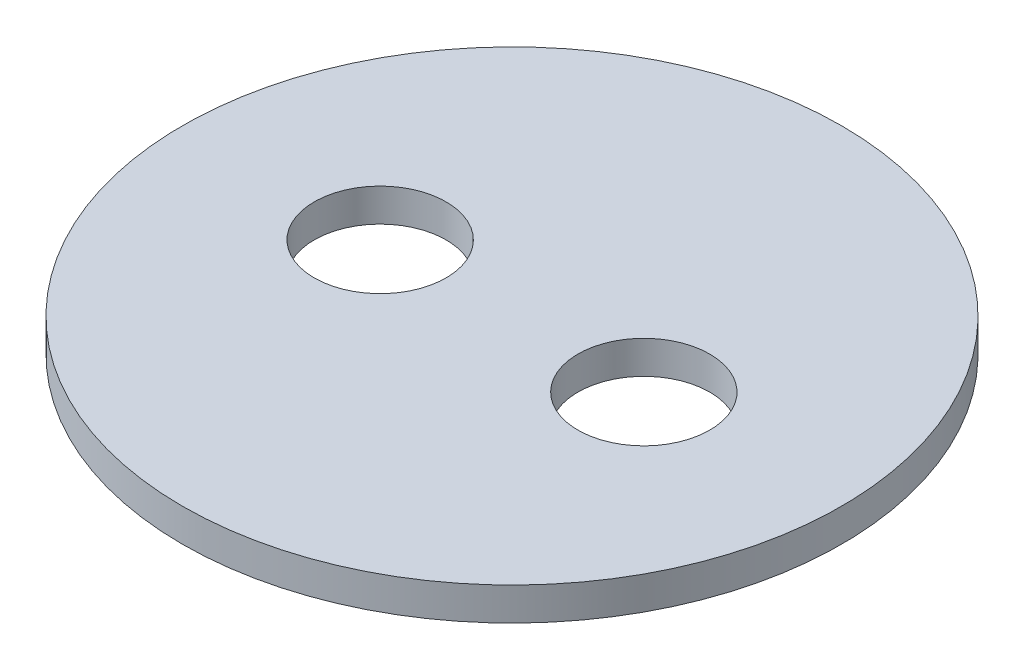
ISO-10303-21;
HEADER;
FILE_DESCRIPTION(('STEP AP214'),'2;1');
FILE_NAME('part.step','',(''),(''),'','','');
FILE_SCHEMA(('AUTOMOTIVE_DESIGN { 1 0 10303 214 1 1 1 1 }'));
ENDSEC;
DATA;
#1=APPLICATION_CONTEXT('core data for automotive mechanical design processes');
#2=APPLICATION_PROTOCOL_DEFINITION('international standard','automotive_design',2000,#1);
#3=PRODUCT_CONTEXT('',#1,'mechanical');
#4=PRODUCT('Part','Part','',(#3));
#5=PRODUCT_RELATED_PRODUCT_CATEGORY('part','',(#4));
#6=PRODUCT_DEFINITION_FORMATION('','',#4);
#7=PRODUCT_DEFINITION_CONTEXT('part definition',#1,'design');
#8=PRODUCT_DEFINITION('design','',#6,#7);
#9=PRODUCT_DEFINITION_SHAPE('','',#8);
#10=(LENGTH_UNIT() NAMED_UNIT(*) SI_UNIT(.MILLI.,.METRE.));
#11=(NAMED_UNIT(*) PLANE_ANGLE_UNIT() SI_UNIT($,.RADIAN.));
#12=(NAMED_UNIT(*) SI_UNIT($,.STERADIAN.) SOLID_ANGLE_UNIT());
#13=UNCERTAINTY_MEASURE_WITH_UNIT(LENGTH_MEASURE(1.E-05),#10,'distance_accuracy_value','');
#14=(GEOMETRIC_REPRESENTATION_CONTEXT(3) GLOBAL_UNCERTAINTY_ASSIGNED_CONTEXT((#13)) GLOBAL_UNIT_ASSIGNED_CONTEXT((#10,
#11,#12)) REPRESENTATION_CONTEXT('',''));
#15=CARTESIAN_POINT('',(0.,0.,0.));
#16=DIRECTION('',(0.,0.,1.));
#17=DIRECTION('',(1.,0.,0.));
#18=AXIS2_PLACEMENT_3D('',#15,#16,#17);
#19=CARTESIAN_POINT('',(0.,1.,0.));
#20=DIRECTION('',(0.,1.,0.));
#21=DIRECTION('',(0.,0.,1.));
#22=AXIS2_PLACEMENT_3D('',#19,#20,#21);
#23=PLANE('',#22);
#24=CARTESIAN_POINT('',(-4.,1.,0.));
#25=DIRECTION('',(0.,1.,0.));
#26=DIRECTION('',(0.,0.,1.));
#27=AXIS2_PLACEMENT_3D('',#24,#25,#26);
#28=CIRCLE('',#27,2.);
#29=CARTESIAN_POINT('',(-4.,1.,2.));
#30=VERTEX_POINT('',#29);
#31=EDGE_CURVE('E41',#30,#30,#28,.T.);
#32=ORIENTED_EDGE('',*,*,#31,.F.);
#33=EDGE_LOOP('',(#32));
#34=FACE_BOUND('',#33,.T.);
#35=CARTESIAN_POINT('',(0.,1.,0.));
#36=DIRECTION('',(0.,1.,0.));
#37=DIRECTION('',(0.,0.,1.));
#38=AXIS2_PLACEMENT_3D('',#35,#36,#37);
#39=CIRCLE('',#38,10.);
#40=CARTESIAN_POINT('',(0.,1.,10.));
#41=VERTEX_POINT('',#40);
#42=EDGE_CURVE('E10',#41,#41,#39,.T.);
#43=ORIENTED_EDGE('',*,*,#42,.T.);
#44=EDGE_LOOP('',(#43));
#45=FACE_BOUND('',#44,.T.);
#46=CARTESIAN_POINT('',(4.00000000000001,1.,0.));
#47=DIRECTION('',(0.,1.,0.));
#48=DIRECTION('',(0.,0.,-1.));
#49=AXIS2_PLACEMENT_3D('',#46,#47,#48);
#50=CIRCLE('',#49,2.);
#51=CARTESIAN_POINT('',(4.00000000000001,1.,-2.));
#52=VERTEX_POINT('',#51);
#53=EDGE_CURVE('E46',#52,#52,#50,.T.);
#54=ORIENTED_EDGE('',*,*,#53,.F.);
#55=EDGE_LOOP('',(#54));
#56=FACE_BOUND('',#55,.T.);
#57=ADVANCED_FACE('F30',(#34,#45,#56),#23,.T.);
#58=CARTESIAN_POINT('',(0.,0.,0.));
#59=DIRECTION('',(0.,1.,0.));
#60=DIRECTION('',(0.,0.,1.));
#61=AXIS2_PLACEMENT_3D('',#58,#59,#60);
#62=PLANE('',#61);
#63=CARTESIAN_POINT('',(-4.,0.,0.));
#64=DIRECTION('',(0.,1.,0.));
#65=DIRECTION('',(0.,0.,1.));
#66=AXIS2_PLACEMENT_3D('',#63,#64,#65);
#67=CIRCLE('',#66,2.);
#68=CARTESIAN_POINT('',(-4.,0.,2.));
#69=VERTEX_POINT('',#68);
#70=EDGE_CURVE('E43',#69,#69,#67,.T.);
#71=ORIENTED_EDGE('',*,*,#70,.T.);
#72=EDGE_LOOP('',(#71));
#73=FACE_BOUND('',#72,.T.);
#74=CARTESIAN_POINT('',(0.,0.,0.));
#75=DIRECTION('',(0.,1.,0.));
#76=DIRECTION('',(0.,0.,1.));
#77=AXIS2_PLACEMENT_3D('',#74,#75,#76);
#78=CIRCLE('',#77,10.);
#79=CARTESIAN_POINT('',(0.,0.,10.));
#80=VERTEX_POINT('',#79);
#81=EDGE_CURVE('E34',#80,#80,#78,.T.);
#82=ORIENTED_EDGE('',*,*,#81,.F.);
#83=EDGE_LOOP('',(#82));
#84=FACE_BOUND('',#83,.T.);
#85=CARTESIAN_POINT('',(4.00000000000001,0.,0.));
#86=DIRECTION('',(0.,1.,0.));
#87=DIRECTION('',(0.,0.,-1.));
#88=AXIS2_PLACEMENT_3D('',#85,#86,#87);
#89=CIRCLE('',#88,2.);
#90=CARTESIAN_POINT('',(4.00000000000001,0.,-2.));
#91=VERTEX_POINT('',#90);
#92=EDGE_CURVE('E49',#91,#91,#89,.T.);
#93=ORIENTED_EDGE('',*,*,#92,.T.);
#94=EDGE_LOOP('',(#93));
#95=FACE_BOUND('',#94,.T.);
#96=ADVANCED_FACE('F59',(#73,#84,#95),#62,.F.);
#97=CARTESIAN_POINT('',(0.,1.,0.));
#98=DIRECTION('',(0.,-1.,0.));
#99=DIRECTION('',(0.,0.,-1.));
#100=AXIS2_PLACEMENT_3D('',#97,#98,#99);
#101=CYLINDRICAL_SURFACE('',#100,10.);
#102=ORIENTED_EDGE('',*,*,#42,.F.);
#103=EDGE_LOOP('',(#102));
#104=FACE_BOUND('',#103,.T.);
#105=ORIENTED_EDGE('',*,*,#81,.T.);
#106=EDGE_LOOP('',(#105));
#107=FACE_BOUND('',#106,.T.);
#108=ADVANCED_FACE('F32',(#104,#107),#101,.T.);
#109=CARTESIAN_POINT('',(-4.,1.,0.));
#110=DIRECTION('',(0.,-1.,0.));
#111=DIRECTION('',(0.,0.,-1.));
#112=AXIS2_PLACEMENT_3D('',#109,#110,#111);
#113=CYLINDRICAL_SURFACE('',#112,2.);
#114=ORIENTED_EDGE('',*,*,#31,.T.);
#115=EDGE_LOOP('',(#114));
#116=FACE_BOUND('',#115,.T.);
#117=ORIENTED_EDGE('',*,*,#70,.F.);
#118=EDGE_LOOP('',(#117));
#119=FACE_BOUND('',#118,.T.);
#120=ADVANCED_FACE('F68',(#116,#119),#113,.F.);
#121=CARTESIAN_POINT('',(4.00000000000001,1.,0.));
#122=DIRECTION('',(0.,-1.,0.));
#123=DIRECTION('',(0.,0.,-1.));
#124=AXIS2_PLACEMENT_3D('',#121,#122,#123);
#125=CYLINDRICAL_SURFACE('',#124,2.);
#126=ORIENTED_EDGE('',*,*,#53,.T.);
#127=EDGE_LOOP('',(#126));
#128=FACE_BOUND('',#127,.T.);
#129=ORIENTED_EDGE('',*,*,#92,.F.);
#130=EDGE_LOOP('',(#129));
#131=FACE_BOUND('',#130,.T.);
#132=ADVANCED_FACE('F55',(#128,#131),#125,.F.);
#133=CLOSED_SHELL('',(#57,#96,#108,#120,#132));
#134=MANIFOLD_SOLID_BREP('B2',#133);
#135=ADVANCED_BREP_SHAPE_REPRESENTATION('',(#18,#134),#14);
#136=SHAPE_DEFINITION_REPRESENTATION(#9,#135);
ENDSEC;
END-ISO-10303-21;
